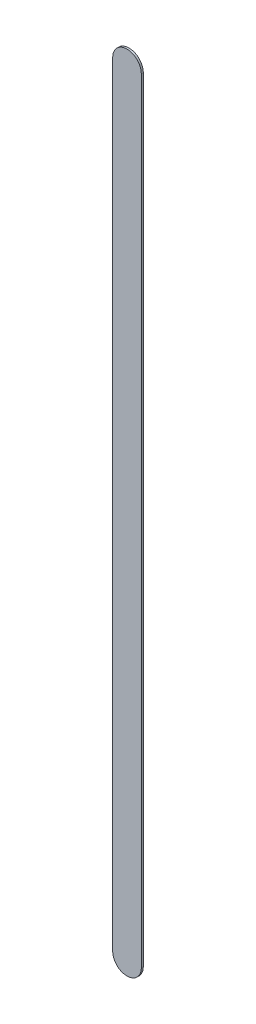
ISO-10303-21;
HEADER;
FILE_DESCRIPTION(('STEP AP214'),'2;1');
FILE_NAME('part.step','',(''),(''),'','','');
FILE_SCHEMA(('AUTOMOTIVE_DESIGN { 1 0 10303 214 1 1 1 1 }'));
ENDSEC;
DATA;
#1=APPLICATION_CONTEXT('core data for automotive mechanical design processes');
#2=APPLICATION_PROTOCOL_DEFINITION('international standard','automotive_design',2000,#1);
#3=PRODUCT_CONTEXT('',#1,'mechanical');
#4=PRODUCT('Part','Part','',(#3));
#5=PRODUCT_RELATED_PRODUCT_CATEGORY('part','',(#4));
#6=PRODUCT_DEFINITION_FORMATION('','',#4);
#7=PRODUCT_DEFINITION_CONTEXT('part definition',#1,'design');
#8=PRODUCT_DEFINITION('design','',#6,#7);
#9=PRODUCT_DEFINITION_SHAPE('','',#8);
#10=(LENGTH_UNIT() NAMED_UNIT(*) SI_UNIT(.MILLI.,.METRE.));
#11=(NAMED_UNIT(*) PLANE_ANGLE_UNIT() SI_UNIT($,.RADIAN.));
#12=(NAMED_UNIT(*) SI_UNIT($,.STERADIAN.) SOLID_ANGLE_UNIT());
#13=UNCERTAINTY_MEASURE_WITH_UNIT(LENGTH_MEASURE(1.E-05),#10,'distance_accuracy_value','');
#14=(GEOMETRIC_REPRESENTATION_CONTEXT(3) GLOBAL_UNCERTAINTY_ASSIGNED_CONTEXT((#13)) GLOBAL_UNIT_ASSIGNED_CONTEXT((#10,
#11,#12)) REPRESENTATION_CONTEXT('',''));
#15=CARTESIAN_POINT('',(0.,0.,0.));
#16=DIRECTION('',(0.,0.,1.));
#17=DIRECTION('',(1.,0.,0.));
#18=AXIS2_PLACEMENT_3D('',#15,#16,#17);
#19=CARTESIAN_POINT('',(154.91,-95.59,1.635));
#20=DIRECTION('',(0.,0.,1.));
#21=DIRECTION('',(1.,0.,0.));
#22=AXIS2_PLACEMENT_3D('',#19,#20,#21);
#23=PLANE('',#22);
#24=DIRECTION('',(0.,-1.,0.));
#25=VECTOR('',#24,1.);
#26=CARTESIAN_POINT('',(154.91,-95.59,1.635));
#27=LINE('',#26,#25);
#28=CARTESIAN_POINT('',(154.91,-95.59,1.635));
#29=VERTEX_POINT('',#28);
#30=CARTESIAN_POINT('',(154.91,-109.12,1.635));
#31=VERTEX_POINT('',#30);
#32=EDGE_CURVE('E69',#29,#31,#27,.T.);
#33=ORIENTED_EDGE('',*,*,#32,.T.);
#34=CARTESIAN_POINT('',(155.16,-109.12,1.635));
#35=DIRECTION('',(0.,0.,1.));
#36=DIRECTION('',(-1.,0.,0.));
#37=AXIS2_PLACEMENT_3D('',#34,#35,#36);
#38=CIRCLE('',#37,0.25);
#39=CARTESIAN_POINT('',(155.41,-109.12,1.635));
#40=VERTEX_POINT('',#39);
#41=EDGE_CURVE('E66',#31,#40,#38,.T.);
#42=ORIENTED_EDGE('',*,*,#41,.T.);
#43=DIRECTION('',(0.,1.,0.));
#44=VECTOR('',#43,1.);
#45=CARTESIAN_POINT('',(155.41,-109.12,1.635));
#46=LINE('',#45,#44);
#47=CARTESIAN_POINT('',(155.41,-95.59,1.635));
#48=VERTEX_POINT('',#47);
#49=EDGE_CURVE('E20',#40,#48,#46,.T.);
#50=ORIENTED_EDGE('',*,*,#49,.T.);
#51=CARTESIAN_POINT('',(155.16,-95.59,1.635));
#52=DIRECTION('',(0.,0.,1.));
#53=DIRECTION('',(1.,0.,0.));
#54=AXIS2_PLACEMENT_3D('',#51,#52,#53);
#55=CIRCLE('',#54,0.25);
#56=EDGE_CURVE('E11',#48,#29,#55,.T.);
#57=ORIENTED_EDGE('',*,*,#56,.T.);
#58=EDGE_LOOP('',(#33,#42,#50,#57));
#59=FACE_BOUND('',#58,.T.);
#60=ADVANCED_FACE('F17',(#59),#23,.T.);
#61=CARTESIAN_POINT('',(154.91,-95.59,1.6));
#62=DIRECTION('',(0.,0.,1.));
#63=DIRECTION('',(1.,0.,0.));
#64=AXIS2_PLACEMENT_3D('',#61,#62,#63);
#65=PLANE('',#64);
#66=CARTESIAN_POINT('',(155.16,-95.59,1.6));
#67=DIRECTION('',(0.,0.,1.));
#68=DIRECTION('',(1.,0.,0.));
#69=AXIS2_PLACEMENT_3D('',#66,#67,#68);
#70=CIRCLE('',#69,0.25);
#71=CARTESIAN_POINT('',(155.41,-95.59,1.6));
#72=VERTEX_POINT('',#71);
#73=CARTESIAN_POINT('',(154.91,-95.59,1.6));
#74=VERTEX_POINT('',#73);
#75=EDGE_CURVE('E27',#72,#74,#70,.T.);
#76=ORIENTED_EDGE('',*,*,#75,.F.);
#77=DIRECTION('',(0.,1.,0.));
#78=VECTOR('',#77,1.);
#79=CARTESIAN_POINT('',(155.41,-109.12,1.6));
#80=LINE('',#79,#78);
#81=CARTESIAN_POINT('',(155.41,-109.12,1.6));
#82=VERTEX_POINT('',#81);
#83=EDGE_CURVE('E74',#82,#72,#80,.T.);
#84=ORIENTED_EDGE('',*,*,#83,.F.);
#85=CARTESIAN_POINT('',(155.16,-109.12,1.6));
#86=DIRECTION('',(0.,0.,1.));
#87=DIRECTION('',(-1.,0.,0.));
#88=AXIS2_PLACEMENT_3D('',#85,#86,#87);
#89=CIRCLE('',#88,0.25);
#90=CARTESIAN_POINT('',(154.91,-109.12,1.6));
#91=VERTEX_POINT('',#90);
#92=EDGE_CURVE('E78',#91,#82,#89,.T.);
#93=ORIENTED_EDGE('',*,*,#92,.F.);
#94=DIRECTION('',(0.,-1.,0.));
#95=VECTOR('',#94,1.);
#96=CARTESIAN_POINT('',(154.91,-95.59,1.6));
#97=LINE('',#96,#95);
#98=EDGE_CURVE('E91',#74,#91,#97,.T.);
#99=ORIENTED_EDGE('',*,*,#98,.F.);
#100=EDGE_LOOP('',(#76,#84,#93,#99));
#101=FACE_BOUND('',#100,.T.);
#102=ADVANCED_FACE('F174',(#101),#65,.F.);
#103=CARTESIAN_POINT('',(155.16,-95.59,1.6));
#104=DIRECTION('',(0.,0.,-1.));
#105=DIRECTION('',(1.,0.,0.));
#106=AXIS2_PLACEMENT_3D('',#103,#104,#105);
#107=CYLINDRICAL_SURFACE('',#106,0.25);
#108=ORIENTED_EDGE('',*,*,#75,.T.);
#109=DIRECTION('',(0.,0.,1.));
#110=VECTOR('',#109,1.);
#111=CARTESIAN_POINT('',(154.91,-95.59,1.6));
#112=LINE('',#111,#110);
#113=EDGE_CURVE('E85',#74,#29,#112,.T.);
#114=ORIENTED_EDGE('',*,*,#113,.T.);
#115=ORIENTED_EDGE('',*,*,#56,.F.);
#116=DIRECTION('',(0.,0.,1.));
#117=VECTOR('',#116,1.);
#118=CARTESIAN_POINT('',(155.41,-95.59,1.6));
#119=LINE('',#118,#117);
#120=EDGE_CURVE('E61',#72,#48,#119,.T.);
#121=ORIENTED_EDGE('',*,*,#120,.F.);
#122=EDGE_LOOP('',(#108,#114,#115,#121));
#123=FACE_BOUND('',#122,.T.);
#124=ADVANCED_FACE('F166',(#123),#107,.T.);
#125=CARTESIAN_POINT('',(155.41,-109.12,1.6));
#126=DIRECTION('',(-1.,0.,0.));
#127=DIRECTION('',(0.,0.,1.));
#128=AXIS2_PLACEMENT_3D('',#125,#126,#127);
#129=PLANE('',#128);
#130=ORIENTED_EDGE('',*,*,#83,.T.);
#131=ORIENTED_EDGE('',*,*,#120,.T.);
#132=ORIENTED_EDGE('',*,*,#49,.F.);
#133=DIRECTION('',(0.,0.,1.));
#134=VECTOR('',#133,1.);
#135=CARTESIAN_POINT('',(155.41,-109.12,1.6));
#136=LINE('',#135,#134);
#137=EDGE_CURVE('E59',#82,#40,#136,.T.);
#138=ORIENTED_EDGE('',*,*,#137,.F.);
#139=EDGE_LOOP('',(#130,#131,#132,#138));
#140=FACE_BOUND('',#139,.T.);
#141=ADVANCED_FACE('F57',(#140),#129,.F.);
#142=CARTESIAN_POINT('',(155.16,-109.12,1.6));
#143=DIRECTION('',(0.,0.,-1.));
#144=DIRECTION('',(-1.,0.,0.));
#145=AXIS2_PLACEMENT_3D('',#142,#143,#144);
#146=CYLINDRICAL_SURFACE('',#145,0.25);
#147=ORIENTED_EDGE('',*,*,#92,.T.);
#148=ORIENTED_EDGE('',*,*,#137,.T.);
#149=ORIENTED_EDGE('',*,*,#41,.F.);
#150=DIRECTION('',(0.,0.,1.));
#151=VECTOR('',#150,1.);
#152=CARTESIAN_POINT('',(154.91,-109.12,1.6));
#153=LINE('',#152,#151);
#154=EDGE_CURVE('E88',#91,#31,#153,.T.);
#155=ORIENTED_EDGE('',*,*,#154,.F.);
#156=EDGE_LOOP('',(#147,#148,#149,#155));
#157=FACE_BOUND('',#156,.T.);
#158=ADVANCED_FACE('F76',(#157),#146,.T.);
#159=CARTESIAN_POINT('',(154.91,-95.59,1.6));
#160=DIRECTION('',(1.,0.,0.));
#161=DIRECTION('',(0.,1.,0.));
#162=AXIS2_PLACEMENT_3D('',#159,#160,#161);
#163=PLANE('',#162);
#164=ORIENTED_EDGE('',*,*,#98,.T.);
#165=ORIENTED_EDGE('',*,*,#154,.T.);
#166=ORIENTED_EDGE('',*,*,#32,.F.);
#167=ORIENTED_EDGE('',*,*,#113,.F.);
#168=EDGE_LOOP('',(#164,#165,#166,#167));
#169=FACE_BOUND('',#168,.T.);
#170=ADVANCED_FACE('F140',(#169),#163,.F.);
#171=CLOSED_SHELL('',(#60,#102,#124,#141,#158,#170));
#172=MANIFOLD_SOLID_BREP('B1',#171);
#173=ADVANCED_BREP_SHAPE_REPRESENTATION('',(#18,#172),#14);
#174=SHAPE_DEFINITION_REPRESENTATION(#9,#173);
ENDSEC;
END-ISO-10303-21;
